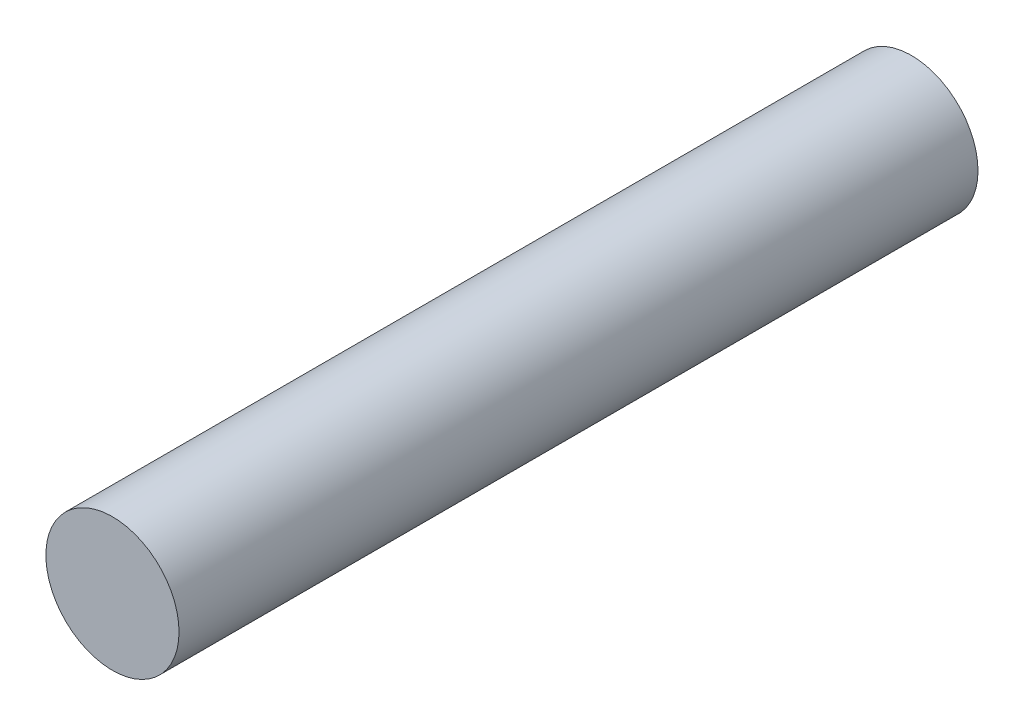
ISO-10303-21;
HEADER;
FILE_DESCRIPTION(('STEP AP214'),'2;1');
FILE_NAME('part.step','',(''),(''),'','','');
FILE_SCHEMA(('AUTOMOTIVE_DESIGN { 1 0 10303 214 1 1 1 1 }'));
ENDSEC;
DATA;
#1=APPLICATION_CONTEXT('core data for automotive mechanical design processes');
#2=APPLICATION_PROTOCOL_DEFINITION('international standard','automotive_design',2000,#1);
#3=PRODUCT_CONTEXT('',#1,'mechanical');
#4=PRODUCT('Part','Part','',(#3));
#5=PRODUCT_RELATED_PRODUCT_CATEGORY('part','',(#4));
#6=PRODUCT_DEFINITION_FORMATION('','',#4);
#7=PRODUCT_DEFINITION_CONTEXT('part definition',#1,'design');
#8=PRODUCT_DEFINITION('design','',#6,#7);
#9=PRODUCT_DEFINITION_SHAPE('','',#8);
#10=(LENGTH_UNIT() NAMED_UNIT(*) SI_UNIT(.MILLI.,.METRE.));
#11=(NAMED_UNIT(*) PLANE_ANGLE_UNIT() SI_UNIT($,.RADIAN.));
#12=(NAMED_UNIT(*) SI_UNIT($,.STERADIAN.) SOLID_ANGLE_UNIT());
#13=UNCERTAINTY_MEASURE_WITH_UNIT(LENGTH_MEASURE(1.E-05),#10,'distance_accuracy_value','');
#14=(GEOMETRIC_REPRESENTATION_CONTEXT(3) GLOBAL_UNCERTAINTY_ASSIGNED_CONTEXT((#13)) GLOBAL_UNIT_ASSIGNED_CONTEXT((#10,
#11,#12)) REPRESENTATION_CONTEXT('',''));
#15=CARTESIAN_POINT('',(0.,0.,0.));
#16=DIRECTION('',(0.,0.,1.));
#17=DIRECTION('',(1.,0.,0.));
#18=AXIS2_PLACEMENT_3D('',#15,#16,#17);
#19=CARTESIAN_POINT('',(0.,0.,457.2));
#20=DIRECTION('',(0.,0.,-1.));
#21=DIRECTION('',(-1.,0.,0.));
#22=AXIS2_PLACEMENT_3D('',#19,#20,#21);
#23=CYLINDRICAL_SURFACE('',#22,38.1);
#24=CARTESIAN_POINT('',(0.,0.,457.2));
#25=DIRECTION('',(0.,0.,1.));
#26=DIRECTION('',(1.,0.,0.));
#27=AXIS2_PLACEMENT_3D('',#24,#25,#26);
#28=CIRCLE('',#27,38.1);
#29=CARTESIAN_POINT('',(38.1,0.,457.2));
#30=VERTEX_POINT('',#29);
#31=EDGE_CURVE('E10',#30,#30,#28,.T.);
#32=ORIENTED_EDGE('',*,*,#31,.F.);
#33=EDGE_LOOP('',(#32));
#34=FACE_BOUND('',#33,.T.);
#35=CARTESIAN_POINT('',(0.,0.,0.));
#36=DIRECTION('',(0.,0.,1.));
#37=DIRECTION('',(1.,0.,0.));
#38=AXIS2_PLACEMENT_3D('',#35,#36,#37);
#39=CIRCLE('',#38,38.1);
#40=CARTESIAN_POINT('',(38.1,0.,0.));
#41=VERTEX_POINT('',#40);
#42=EDGE_CURVE('E34',#41,#41,#39,.T.);
#43=ORIENTED_EDGE('',*,*,#42,.T.);
#44=EDGE_LOOP('',(#43));
#45=FACE_BOUND('',#44,.T.);
#46=ADVANCED_FACE('F31',(#34,#45),#23,.T.);
#47=CARTESIAN_POINT('',(0.,0.,457.2));
#48=DIRECTION('',(0.,0.,1.));
#49=DIRECTION('',(1.,0.,0.));
#50=AXIS2_PLACEMENT_3D('',#47,#48,#49);
#51=PLANE('',#50);
#52=ORIENTED_EDGE('',*,*,#31,.T.);
#53=EDGE_LOOP('',(#52));
#54=FACE_BOUND('',#53,.T.);
#55=ADVANCED_FACE('F46',(#54),#51,.T.);
#56=CARTESIAN_POINT('',(0.,0.,0.));
#57=DIRECTION('',(0.,0.,1.));
#58=DIRECTION('',(1.,0.,0.));
#59=AXIS2_PLACEMENT_3D('',#56,#57,#58);
#60=PLANE('',#59);
#61=ORIENTED_EDGE('',*,*,#42,.F.);
#62=EDGE_LOOP('',(#61));
#63=FACE_BOUND('',#62,.T.);
#64=ADVANCED_FACE('F44',(#63),#60,.F.);
#65=CLOSED_SHELL('',(#46,#55,#64));
#66=MANIFOLD_SOLID_BREP('B2',#65);
#67=ADVANCED_BREP_SHAPE_REPRESENTATION('',(#18,#66),#14);
#68=SHAPE_DEFINITION_REPRESENTATION(#9,#67);
ENDSEC;
END-ISO-10303-21;
